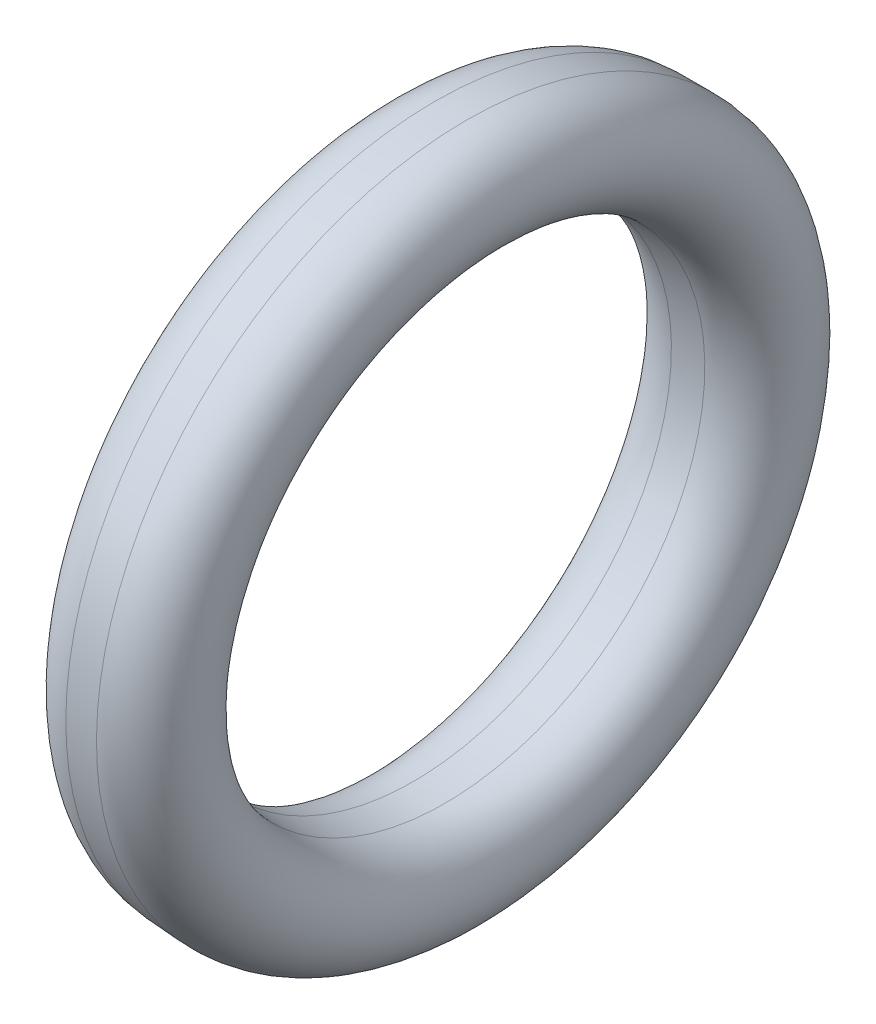
ISO-10303-21;
HEADER;
FILE_DESCRIPTION(('STEP AP214'),'2;1');
FILE_NAME('part.step','',(''),(''),'','','');
FILE_SCHEMA(('AUTOMOTIVE_DESIGN { 1 0 10303 214 1 1 1 1 }'));
ENDSEC;
DATA;
#1=APPLICATION_CONTEXT('core data for automotive mechanical design processes');
#2=APPLICATION_PROTOCOL_DEFINITION('international standard','automotive_design',2000,#1);
#3=PRODUCT_CONTEXT('',#1,'mechanical');
#4=PRODUCT('Part','Part','',(#3));
#5=PRODUCT_RELATED_PRODUCT_CATEGORY('part','',(#4));
#6=PRODUCT_DEFINITION_FORMATION('','',#4);
#7=PRODUCT_DEFINITION_CONTEXT('part definition',#1,'design');
#8=PRODUCT_DEFINITION('design','',#6,#7);
#9=PRODUCT_DEFINITION_SHAPE('','',#8);
#10=(LENGTH_UNIT() NAMED_UNIT(*) SI_UNIT(.MILLI.,.METRE.));
#11=(NAMED_UNIT(*) PLANE_ANGLE_UNIT() SI_UNIT($,.RADIAN.));
#12=(NAMED_UNIT(*) SI_UNIT($,.STERADIAN.) SOLID_ANGLE_UNIT());
#13=UNCERTAINTY_MEASURE_WITH_UNIT(LENGTH_MEASURE(1.E-05),#10,'distance_accuracy_value','');
#14=(GEOMETRIC_REPRESENTATION_CONTEXT(3) GLOBAL_UNCERTAINTY_ASSIGNED_CONTEXT((#13)) GLOBAL_UNIT_ASSIGNED_CONTEXT((#10,
#11,#12)) REPRESENTATION_CONTEXT('',''));
#15=CARTESIAN_POINT('',(0.,0.,0.));
#16=DIRECTION('',(0.,0.,1.));
#17=DIRECTION('',(1.,0.,0.));
#18=AXIS2_PLACEMENT_3D('',#15,#16,#17);
#19=CARTESIAN_POINT('',(-145.032967480393,-161.743923480785,0.));
#20=DIRECTION('',(0.999039600578672,-0.0438163950549134,0.));
#21=DIRECTION('',(0.0438163950549134,0.999039600578672,0.));
#22=AXIS2_PLACEMENT_3D('',#19,#20,#21);
#23=CONICAL_SURFACE('',#22,222.717753078698,0.032919099562413);
#24=CARTESIAN_POINT('',(-125.06180706314,-162.619828954442,0.));
#25=DIRECTION('',(0.999039600578672,-0.0438163950549134,0.));
#26=DIRECTION('',(0.0438163950549134,0.999039600578672,0.));
#27=AXIS2_PLACEMENT_3D('',#24,#25,#26);
#28=CIRCLE('',#27,223.376055512481);
#29=CARTESIAN_POINT('',(-115.274273568997,60.5416963235861,0.));
#30=VERTEX_POINT('',#29);
#31=EDGE_CURVE('E45',#30,#30,#28,.T.);
#32=ORIENTED_EDGE('',*,*,#31,.F.);
#33=EDGE_LOOP('',(#32));
#34=FACE_BOUND('',#33,.T.);
#35=CARTESIAN_POINT('',(-145.032967480393,-161.743923480785,0.));
#36=DIRECTION('',(0.999039600578672,-0.0438163950549134,0.));
#37=DIRECTION('',(0.0438163950549134,0.999039600578672,0.));
#38=AXIS2_PLACEMENT_3D('',#35,#36,#37);
#39=CIRCLE('',#38,222.717753078698);
#40=CARTESIAN_POINT('',(-135.274278425754,60.7599315967367,0.));
#41=VERTEX_POINT('',#40);
#42=EDGE_CURVE('E10',#41,#41,#39,.T.);
#43=ORIENTED_EDGE('',*,*,#42,.T.);
#44=EDGE_LOOP('',(#43));
#45=FACE_BOUND('',#44,.T.);
#46=ADVANCED_FACE('F31',(#34,#45),#23,.T.);
#47=CARTESIAN_POINT('',(-143.590265123961,-161.807198266248,0.));
#48=DIRECTION('',(0.999039600578672,-0.0438163950549134,0.));
#49=DIRECTION('',(0.0438163950549134,0.999039600578672,0.));
#50=AXIS2_PLACEMENT_3D('',#47,#48,#49);
#51=TOROIDAL_SURFACE('',#50,189.277774015427,33.4711456860937);
#52=CARTESIAN_POINT('',(-142.102615273492,-161.872444382132,0.));
#53=DIRECTION('',(0.999039600578672,-0.0438163950549134,0.));
#54=DIRECTION('',(0.0438163950549134,0.999039600578672,0.));
#55=AXIS2_PLACEMENT_3D('',#52,#53,#54);
#56=CIRCLE('',#55,155.839768177661);
#57=CARTESIAN_POINT('',(-135.274278425753,-6.18234462764833,0.));
#58=VERTEX_POINT('',#57);
#59=EDGE_CURVE('E37',#58,#58,#56,.T.);
#60=ORIENTED_EDGE('',*,*,#59,.T.);
#61=EDGE_LOOP('',(#60));
#62=FACE_BOUND('',#61,.T.);
#63=ORIENTED_EDGE('',*,*,#42,.F.);
#64=EDGE_LOOP('',(#63));
#65=FACE_BOUND('',#64,.T.);
#66=ADVANCED_FACE('F96',(#62,#65),#51,.T.);
#67=CARTESIAN_POINT('',(-142.102615273492,-161.872444382132,0.));
#68=DIRECTION('',(0.999039600578672,-0.0438163950549134,0.));
#69=DIRECTION('',(0.0438163950549134,0.999039600578672,0.));
#70=AXIS2_PLACEMENT_3D('',#67,#68,#69);
#71=CONICAL_SURFACE('',#70,155.839768177661,0.0547417554894417);
#72=CARTESIAN_POINT('',(-122.150561054905,-162.747511886255,0.));
#73=DIRECTION('',(0.999039600578672,-0.0438163950549134,0.));
#74=DIRECTION('',(0.0438163950549134,0.999039600578672,0.));
#75=AXIS2_PLACEMENT_3D('',#72,#73,#74);
#76=CIRCLE('',#75,156.934121971685);
#77=CARTESIAN_POINT('',(-115.274273568998,-5.96410935449768,0.));
#78=VERTEX_POINT('',#77);
#79=EDGE_CURVE('E41',#78,#78,#76,.T.);
#80=ORIENTED_EDGE('',*,*,#79,.T.);
#81=EDGE_LOOP('',(#80));
#82=FACE_BOUND('',#81,.T.);
#83=ORIENTED_EDGE('',*,*,#59,.F.);
#84=EDGE_LOOP('',(#83));
#85=FACE_BOUND('',#84,.T.);
#86=ADVANCED_FACE('F93',(#82,#85),#71,.F.);
#87=CARTESIAN_POINT('',(-123.628662653473,-162.682684542537,0.));
#88=DIRECTION('',(0.999039600578672,-0.0438163950549134,0.));
#89=DIRECTION('',(0.0438163950549134,0.999039600578672,0.));
#90=AXIS2_PLACEMENT_3D('',#87,#88,#89);
#91=TOROIDAL_SURFACE('',#90,190.154101916525,33.2529104659389);
#92=ORIENTED_EDGE('',*,*,#31,.T.);
#93=EDGE_LOOP('',(#92));
#94=FACE_BOUND('',#93,.T.);
#95=ORIENTED_EDGE('',*,*,#79,.F.);
#96=EDGE_LOOP('',(#95));
#97=FACE_BOUND('',#96,.T.);
#98=ADVANCED_FACE('F91',(#94,#97),#91,.T.);
#99=CLOSED_SHELL('',(#46,#66,#86,#98));
#100=CARTESIAN_POINT('',(-144.880344303696,-161.750617306936,0.));
#101=DIRECTION('',(0.999039600578672,-0.0438163950549134,0.));
#102=DIRECTION('',(0.0438163950549134,0.999039600578672,0.));
#103=AXIS2_PLACEMENT_3D('',#100,#101,#102);
#104=CONICAL_SURFACE('',#103,218.720615630258,0.0329190995624127);
#105=CARTESIAN_POINT('',(-124.909188736195,-162.626522567891,0.));
#106=DIRECTION('',(0.999039600578672,-0.0438163950549134,0.));
#107=DIRECTION('',(0.0438163950549134,0.999039600578672,0.));
#108=AXIS2_PLACEMENT_3D('',#105,#106,#107);
#109=CIRCLE('',#108,219.378917904181);
#110=CARTESIAN_POINT('',(-115.296795402586,56.5417039504831,0.));
#111=VERTEX_POINT('',#110);
#112=EDGE_CURVE('E59',#111,#111,#109,.T.);
#113=ORIENTED_EDGE('',*,*,#112,.T.);
#114=EDGE_LOOP('',(#113));
#115=FACE_BOUND('',#114,.T.);
#116=CARTESIAN_POINT('',(-144.880344303696,-161.750617306936,0.));
#117=DIRECTION('',(0.999039600578672,-0.0438163950549134,0.));
#118=DIRECTION('',(0.0438163950549134,0.999039600578672,0.));
#119=AXIS2_PLACEMENT_3D('',#116,#117,#118);
#120=CIRCLE('',#119,218.720615630258);
#121=CARTESIAN_POINT('',(-135.296795402586,56.7599391706379,0.));
#122=VERTEX_POINT('',#121);
#123=EDGE_CURVE('E50',#122,#122,#120,.T.);
#124=ORIENTED_EDGE('',*,*,#123,.F.);
#125=EDGE_LOOP('',(#124));
#126=FACE_BOUND('',#125,.T.);
#127=ADVANCED_FACE('F63',(#115,#126),#104,.F.);
#128=CARTESIAN_POINT('',(-143.590265123961,-161.807198266248,0.));
#129=DIRECTION('',(0.999039600578672,-0.0438163950549134,0.));
#130=DIRECTION('',(0.0438163950549134,0.999039600578672,0.));
#131=AXIS2_PLACEMENT_3D('',#128,#129,#130);
#132=TOROIDAL_SURFACE('',#131,189.277774015427,29.4711456860937);
#133=CARTESIAN_POINT('',(-142.300185944226,-161.86377922556,0.));
#134=DIRECTION('',(0.999039600578672,-0.0438163950549134,0.));
#135=DIRECTION('',(0.0438163950549134,0.999039600578672,0.));
#136=AXIS2_PLACEMENT_3D('',#133,#134,#135);
#137=CIRCLE('',#136,159.834932400596);
#138=CARTESIAN_POINT('',(-135.296795402586,-2.18235220154961,0.));
#139=VERTEX_POINT('',#138);
#140=EDGE_CURVE('E53',#139,#139,#137,.T.);
#141=ORIENTED_EDGE('',*,*,#140,.F.);
#142=EDGE_LOOP('',(#141));
#143=FACE_BOUND('',#142,.T.);
#144=ORIENTED_EDGE('',*,*,#123,.T.);
#145=EDGE_LOOP('',(#144));
#146=FACE_BOUND('',#145,.T.);
#147=ADVANCED_FACE('F76',(#143,#146),#132,.F.);
#148=CARTESIAN_POINT('',(-142.300185944226,-161.86377922556,0.));
#149=DIRECTION('',(0.999039600578672,-0.0438163950549134,0.));
#150=DIRECTION('',(0.0438163950549134,0.999039600578672,0.));
#151=AXIS2_PLACEMENT_3D('',#148,#149,#150);
#152=CONICAL_SURFACE('',#151,159.834932400596,0.0547417554894401);
#153=CARTESIAN_POINT('',(-122.348136570751,-162.738846517184,0.));
#154=DIRECTION('',(0.999039600578672,-0.0438163950549134,0.));
#155=DIRECTION('',(0.0438163950549134,0.999039600578672,0.));
#156=AXIS2_PLACEMENT_3D('',#153,#154,#155);
#157=CIRCLE('',#156,160.92928592887);
#158=CARTESIAN_POINT('',(-115.296795402586,-1.96411698139462,0.));
#159=VERTEX_POINT('',#158);
#160=EDGE_CURVE('E56',#159,#159,#157,.T.);
#161=ORIENTED_EDGE('',*,*,#160,.F.);
#162=EDGE_LOOP('',(#161));
#163=FACE_BOUND('',#162,.T.);
#164=ORIENTED_EDGE('',*,*,#140,.T.);
#165=EDGE_LOOP('',(#164));
#166=FACE_BOUND('',#165,.T.);
#167=ADVANCED_FACE('F69',(#163,#166),#152,.T.);
#168=CARTESIAN_POINT('',(-123.628662653473,-162.682684542537,0.));
#169=DIRECTION('',(0.999039600578672,-0.0438163950549134,0.));
#170=DIRECTION('',(0.0438163950549134,0.999039600578672,0.));
#171=AXIS2_PLACEMENT_3D('',#168,#169,#170);
#172=TOROIDAL_SURFACE('',#171,190.154101916525,29.2529104659389);
#173=ORIENTED_EDGE('',*,*,#112,.F.);
#174=EDGE_LOOP('',(#173));
#175=FACE_BOUND('',#174,.T.);
#176=ORIENTED_EDGE('',*,*,#160,.T.);
#177=EDGE_LOOP('',(#176));
#178=FACE_BOUND('',#177,.T.);
#179=ADVANCED_FACE('F66',(#175,#178),#172,.F.);
#180=CLOSED_SHELL('',(#127,#147,#167,#179));
#181=ORIENTED_CLOSED_SHELL('',*,#180,.T.);
#182=BREP_WITH_VOIDS('B2',#99,(#181));
#183=ADVANCED_BREP_SHAPE_REPRESENTATION('',(#18,#182),#14);
#184=SHAPE_DEFINITION_REPRESENTATION(#9,#183);
ENDSEC;
END-ISO-10303-21;
